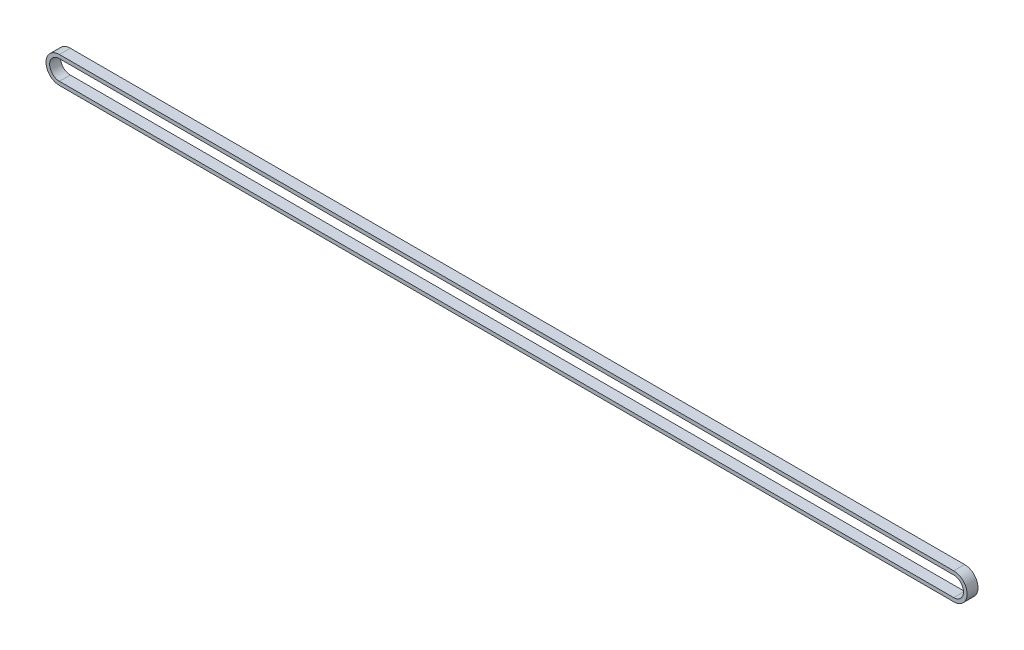
ISO-10303-21;
HEADER;
FILE_DESCRIPTION(('STEP AP214'),'2;1');
FILE_NAME('part.step','',(''),(''),'','','');
FILE_SCHEMA(('AUTOMOTIVE_DESIGN { 1 0 10303 214 1 1 1 1 }'));
ENDSEC;
DATA;
#1=APPLICATION_CONTEXT('core data for automotive mechanical design processes');
#2=APPLICATION_PROTOCOL_DEFINITION('international standard','automotive_design',2000,#1);
#3=PRODUCT_CONTEXT('',#1,'mechanical');
#4=PRODUCT('Part','Part','',(#3));
#5=PRODUCT_RELATED_PRODUCT_CATEGORY('part','',(#4));
#6=PRODUCT_DEFINITION_FORMATION('','',#4);
#7=PRODUCT_DEFINITION_CONTEXT('part definition',#1,'design');
#8=PRODUCT_DEFINITION('design','',#6,#7);
#9=PRODUCT_DEFINITION_SHAPE('','',#8);
#10=(LENGTH_UNIT() NAMED_UNIT(*) SI_UNIT(.MILLI.,.METRE.));
#11=(NAMED_UNIT(*) PLANE_ANGLE_UNIT() SI_UNIT($,.RADIAN.));
#12=(NAMED_UNIT(*) SI_UNIT($,.STERADIAN.) SOLID_ANGLE_UNIT());
#13=UNCERTAINTY_MEASURE_WITH_UNIT(LENGTH_MEASURE(1.E-05),#10,'distance_accuracy_value','');
#14=(GEOMETRIC_REPRESENTATION_CONTEXT(3) GLOBAL_UNCERTAINTY_ASSIGNED_CONTEXT((#13)) GLOBAL_UNIT_ASSIGNED_CONTEXT((#10,
#11,#12)) REPRESENTATION_CONTEXT('',''));
#15=CARTESIAN_POINT('',(0.,0.,0.));
#16=DIRECTION('',(0.,0.,1.));
#17=DIRECTION('',(1.,0.,0.));
#18=AXIS2_PLACEMENT_3D('',#15,#16,#17);
#19=CARTESIAN_POINT('',(0.,-7.4,3.));
#20=DIRECTION('',(0.,1.,0.));
#21=DIRECTION('',(0.,0.,1.));
#22=AXIS2_PLACEMENT_3D('',#19,#20,#21);
#23=PLANE('',#22);
#24=DIRECTION('',(1.,0.,0.));
#25=VECTOR('',#24,1.);
#26=CARTESIAN_POINT('',(0.,-7.4,-3.));
#27=LINE('',#26,#25);
#28=CARTESIAN_POINT('',(-246.5,-7.40000000000001,-3.));
#29=VERTEX_POINT('',#28);
#30=CARTESIAN_POINT('',(246.5,-7.40000000000001,-3.));
#31=VERTEX_POINT('',#30);
#32=EDGE_CURVE('E143',#29,#31,#27,.T.);
#33=ORIENTED_EDGE('',*,*,#32,.T.);
#34=DIRECTION('',(0.,0.,-1.));
#35=VECTOR('',#34,1.);
#36=CARTESIAN_POINT('',(246.5,-7.40000000000001,3.));
#37=LINE('',#36,#35);
#38=CARTESIAN_POINT('',(246.5,-7.40000000000001,3.));
#39=VERTEX_POINT('',#38);
#40=EDGE_CURVE('E11',#39,#31,#37,.T.);
#41=ORIENTED_EDGE('',*,*,#40,.F.);
#42=DIRECTION('',(1.,0.,0.));
#43=VECTOR('',#42,1.);
#44=CARTESIAN_POINT('',(0.,-7.4,3.));
#45=LINE('',#44,#43);
#46=CARTESIAN_POINT('',(-246.5,-7.40000000000001,3.));
#47=VERTEX_POINT('',#46);
#48=EDGE_CURVE('E123',#47,#39,#45,.T.);
#49=ORIENTED_EDGE('',*,*,#48,.F.);
#50=DIRECTION('',(0.,0.,-1.));
#51=VECTOR('',#50,1.);
#52=CARTESIAN_POINT('',(-246.5,-7.40000000000001,3.));
#53=LINE('',#52,#51);
#54=EDGE_CURVE('E150',#47,#29,#53,.T.);
#55=ORIENTED_EDGE('',*,*,#54,.T.);
#56=EDGE_LOOP('',(#33,#41,#49,#55));
#57=FACE_BOUND('',#56,.T.);
#58=ADVANCED_FACE('F37',(#57),#23,.F.);
#59=CARTESIAN_POINT('',(246.5,0.,3.));
#60=DIRECTION('',(0.,0.,-1.));
#61=DIRECTION('',(-1.,0.,0.));
#62=AXIS2_PLACEMENT_3D('',#59,#60,#61);
#63=CYLINDRICAL_SURFACE('',#62,7.40000000000002);
#64=CARTESIAN_POINT('',(246.5,0.,-3.));
#65=DIRECTION('',(0.,0.,1.));
#66=DIRECTION('',(1.,0.,0.));
#67=AXIS2_PLACEMENT_3D('',#64,#65,#66);
#68=CIRCLE('',#67,7.40000000000002);
#69=CARTESIAN_POINT('',(246.5,7.40000000000001,-3.));
#70=VERTEX_POINT('',#69);
#71=EDGE_CURVE('E114',#70,#31,#68,.F.);
#72=ORIENTED_EDGE('',*,*,#71,.F.);
#73=DIRECTION('',(0.,0.,-1.));
#74=VECTOR('',#73,1.);
#75=CARTESIAN_POINT('',(246.5,7.40000000000001,3.));
#76=LINE('',#75,#74);
#77=CARTESIAN_POINT('',(246.5,7.40000000000001,3.));
#78=VERTEX_POINT('',#77);
#79=EDGE_CURVE('E47',#78,#70,#76,.T.);
#80=ORIENTED_EDGE('',*,*,#79,.F.);
#81=CARTESIAN_POINT('',(246.5,0.,3.));
#82=DIRECTION('',(0.,0.,1.));
#83=DIRECTION('',(1.,0.,0.));
#84=AXIS2_PLACEMENT_3D('',#81,#82,#83);
#85=CIRCLE('',#84,7.40000000000002);
#86=EDGE_CURVE('E112',#78,#39,#85,.F.);
#87=ORIENTED_EDGE('',*,*,#86,.T.);
#88=ORIENTED_EDGE('',*,*,#40,.T.);
#89=EDGE_LOOP('',(#72,#80,#87,#88));
#90=FACE_BOUND('',#89,.T.);
#91=ADVANCED_FACE('F111',(#90),#63,.T.);
#92=CARTESIAN_POINT('',(0.,7.4,3.));
#93=DIRECTION('',(0.,1.,0.));
#94=DIRECTION('',(0.,0.,1.));
#95=AXIS2_PLACEMENT_3D('',#92,#93,#94);
#96=PLANE('',#95);
#97=DIRECTION('',(1.,0.,0.));
#98=VECTOR('',#97,1.);
#99=CARTESIAN_POINT('',(0.,7.4,-3.));
#100=LINE('',#99,#98);
#101=CARTESIAN_POINT('',(-246.5,7.40000000000001,-3.));
#102=VERTEX_POINT('',#101);
#103=EDGE_CURVE('E147',#102,#70,#100,.T.);
#104=ORIENTED_EDGE('',*,*,#103,.F.);
#105=DIRECTION('',(0.,0.,-1.));
#106=VECTOR('',#105,1.);
#107=CARTESIAN_POINT('',(-246.5,7.40000000000001,3.));
#108=LINE('',#107,#106);
#109=CARTESIAN_POINT('',(-246.5,7.40000000000001,3.));
#110=VERTEX_POINT('',#109);
#111=EDGE_CURVE('E83',#110,#102,#108,.T.);
#112=ORIENTED_EDGE('',*,*,#111,.F.);
#113=DIRECTION('',(1.,0.,0.));
#114=VECTOR('',#113,1.);
#115=CARTESIAN_POINT('',(0.,7.4,3.));
#116=LINE('',#115,#114);
#117=EDGE_CURVE('E121',#110,#78,#116,.T.);
#118=ORIENTED_EDGE('',*,*,#117,.T.);
#119=ORIENTED_EDGE('',*,*,#79,.T.);
#120=EDGE_LOOP('',(#104,#112,#118,#119));
#121=FACE_BOUND('',#120,.T.);
#122=ADVANCED_FACE('F126',(#121),#96,.T.);
#123=CARTESIAN_POINT('',(246.5,0.,3.));
#124=DIRECTION('',(0.,0.,-1.));
#125=DIRECTION('',(-1.,0.,0.));
#126=AXIS2_PLACEMENT_3D('',#123,#124,#125);
#127=CYLINDRICAL_SURFACE('',#126,5.40000000000002);
#128=CARTESIAN_POINT('',(246.5,0.,-3.));
#129=DIRECTION('',(0.,0.,1.));
#130=DIRECTION('',(1.,0.,0.));
#131=AXIS2_PLACEMENT_3D('',#128,#129,#130);
#132=CIRCLE('',#131,5.40000000000002);
#133=CARTESIAN_POINT('',(246.5,5.4,-3.));
#134=VERTEX_POINT('',#133);
#135=CARTESIAN_POINT('',(246.5,-5.4,-3.));
#136=VERTEX_POINT('',#135);
#137=EDGE_CURVE('E132',#134,#136,#132,.F.);
#138=ORIENTED_EDGE('',*,*,#137,.T.);
#139=DIRECTION('',(0.,0.,-1.));
#140=VECTOR('',#139,1.);
#141=CARTESIAN_POINT('',(246.5,-5.4,3.));
#142=LINE('',#141,#140);
#143=CARTESIAN_POINT('',(246.5,-5.4,3.));
#144=VERTEX_POINT('',#143);
#145=EDGE_CURVE('E41',#144,#136,#142,.T.);
#146=ORIENTED_EDGE('',*,*,#145,.F.);
#147=CARTESIAN_POINT('',(246.5,0.,3.));
#148=DIRECTION('',(0.,0.,1.));
#149=DIRECTION('',(1.,0.,0.));
#150=AXIS2_PLACEMENT_3D('',#147,#148,#149);
#151=CIRCLE('',#150,5.40000000000002);
#152=CARTESIAN_POINT('',(246.5,5.4,3.));
#153=VERTEX_POINT('',#152);
#154=EDGE_CURVE('E95',#153,#144,#151,.F.);
#155=ORIENTED_EDGE('',*,*,#154,.F.);
#156=DIRECTION('',(0.,0.,-1.));
#157=VECTOR('',#156,1.);
#158=CARTESIAN_POINT('',(246.5,5.4,3.));
#159=LINE('',#158,#157);
#160=EDGE_CURVE('E128',#153,#134,#159,.T.);
#161=ORIENTED_EDGE('',*,*,#160,.T.);
#162=EDGE_LOOP('',(#138,#146,#155,#161));
#163=FACE_BOUND('',#162,.T.);
#164=ADVANCED_FACE('F39',(#163),#127,.F.);
#165=CARTESIAN_POINT('',(0.,-5.4,3.));
#166=DIRECTION('',(0.,1.,0.));
#167=DIRECTION('',(0.,0.,1.));
#168=AXIS2_PLACEMENT_3D('',#165,#166,#167);
#169=PLANE('',#168);
#170=DIRECTION('',(1.,0.,0.));
#171=VECTOR('',#170,1.);
#172=CARTESIAN_POINT('',(0.,-5.4,-3.));
#173=LINE('',#172,#171);
#174=CARTESIAN_POINT('',(-246.5,-5.4,-3.));
#175=VERTEX_POINT('',#174);
#176=EDGE_CURVE('E135',#175,#136,#173,.T.);
#177=ORIENTED_EDGE('',*,*,#176,.F.);
#178=DIRECTION('',(0.,0.,-1.));
#179=VECTOR('',#178,1.);
#180=CARTESIAN_POINT('',(-246.5,-5.4,3.));
#181=LINE('',#180,#179);
#182=CARTESIAN_POINT('',(-246.5,-5.4,3.));
#183=VERTEX_POINT('',#182);
#184=EDGE_CURVE('E156',#183,#175,#181,.T.);
#185=ORIENTED_EDGE('',*,*,#184,.F.);
#186=DIRECTION('',(1.,0.,0.));
#187=VECTOR('',#186,1.);
#188=CARTESIAN_POINT('',(0.,-5.4,3.));
#189=LINE('',#188,#187);
#190=EDGE_CURVE('E164',#183,#144,#189,.T.);
#191=ORIENTED_EDGE('',*,*,#190,.T.);
#192=ORIENTED_EDGE('',*,*,#145,.T.);
#193=EDGE_LOOP('',(#177,#185,#191,#192));
#194=FACE_BOUND('',#193,.T.);
#195=ADVANCED_FACE('F163',(#194),#169,.T.);
#196=CARTESIAN_POINT('',(-246.5,0.,3.));
#197=DIRECTION('',(0.,0.,-1.));
#198=DIRECTION('',(-1.,0.,0.));
#199=AXIS2_PLACEMENT_3D('',#196,#197,#198);
#200=CYLINDRICAL_SURFACE('',#199,5.40000000000002);
#201=CARTESIAN_POINT('',(-246.5,0.,-3.));
#202=DIRECTION('',(0.,0.,1.));
#203=DIRECTION('',(1.,0.,0.));
#204=AXIS2_PLACEMENT_3D('',#201,#202,#203);
#205=CIRCLE('',#204,5.40000000000002);
#206=CARTESIAN_POINT('',(-246.5,5.4,-3.));
#207=VERTEX_POINT('',#206);
#208=EDGE_CURVE('E138',#207,#175,#205,.T.);
#209=ORIENTED_EDGE('',*,*,#208,.F.);
#210=DIRECTION('',(0.,0.,-1.));
#211=VECTOR('',#210,1.);
#212=CARTESIAN_POINT('',(-246.5,5.4,3.));
#213=LINE('',#212,#211);
#214=CARTESIAN_POINT('',(-246.5,5.4,3.));
#215=VERTEX_POINT('',#214);
#216=EDGE_CURVE('E155',#215,#207,#213,.T.);
#217=ORIENTED_EDGE('',*,*,#216,.F.);
#218=CARTESIAN_POINT('',(-246.5,0.,3.));
#219=DIRECTION('',(0.,0.,1.));
#220=DIRECTION('',(1.,0.,0.));
#221=AXIS2_PLACEMENT_3D('',#218,#219,#220);
#222=CIRCLE('',#221,5.40000000000002);
#223=EDGE_CURVE('E175',#215,#183,#222,.T.);
#224=ORIENTED_EDGE('',*,*,#223,.T.);
#225=ORIENTED_EDGE('',*,*,#184,.T.);
#226=EDGE_LOOP('',(#209,#217,#224,#225));
#227=FACE_BOUND('',#226,.T.);
#228=ADVANCED_FACE('F172',(#227),#200,.F.);
#229=CARTESIAN_POINT('',(0.,5.4,3.));
#230=DIRECTION('',(0.,1.,0.));
#231=DIRECTION('',(0.,0.,1.));
#232=AXIS2_PLACEMENT_3D('',#229,#230,#231);
#233=PLANE('',#232);
#234=DIRECTION('',(1.,0.,0.));
#235=VECTOR('',#234,1.);
#236=CARTESIAN_POINT('',(0.,5.4,-3.));
#237=LINE('',#236,#235);
#238=EDGE_CURVE('E141',#207,#134,#237,.T.);
#239=ORIENTED_EDGE('',*,*,#238,.T.);
#240=ORIENTED_EDGE('',*,*,#160,.F.);
#241=DIRECTION('',(1.,0.,0.));
#242=VECTOR('',#241,1.);
#243=CARTESIAN_POINT('',(0.,5.4,3.));
#244=LINE('',#243,#242);
#245=EDGE_CURVE('E177',#215,#153,#244,.T.);
#246=ORIENTED_EDGE('',*,*,#245,.F.);
#247=ORIENTED_EDGE('',*,*,#216,.T.);
#248=EDGE_LOOP('',(#239,#240,#246,#247));
#249=FACE_BOUND('',#248,.T.);
#250=ADVANCED_FACE('F178',(#249),#233,.F.);
#251=CARTESIAN_POINT('',(-246.5,0.,3.));
#252=DIRECTION('',(0.,0.,-1.));
#253=DIRECTION('',(-1.,0.,0.));
#254=AXIS2_PLACEMENT_3D('',#251,#252,#253);
#255=CYLINDRICAL_SURFACE('',#254,7.40000000000002);
#256=CARTESIAN_POINT('',(-246.5,0.,-3.));
#257=DIRECTION('',(0.,0.,1.));
#258=DIRECTION('',(1.,0.,0.));
#259=AXIS2_PLACEMENT_3D('',#256,#257,#258);
#260=CIRCLE('',#259,7.40000000000002);
#261=EDGE_CURVE('E86',#102,#29,#260,.T.);
#262=ORIENTED_EDGE('',*,*,#261,.T.);
#263=ORIENTED_EDGE('',*,*,#54,.F.);
#264=CARTESIAN_POINT('',(-246.5,0.,3.));
#265=DIRECTION('',(0.,0.,1.));
#266=DIRECTION('',(1.,0.,0.));
#267=AXIS2_PLACEMENT_3D('',#264,#265,#266);
#268=CIRCLE('',#267,7.40000000000002);
#269=EDGE_CURVE('E56',#110,#47,#268,.T.);
#270=ORIENTED_EDGE('',*,*,#269,.F.);
#271=ORIENTED_EDGE('',*,*,#111,.T.);
#272=EDGE_LOOP('',(#262,#263,#270,#271));
#273=FACE_BOUND('',#272,.T.);
#274=ADVANCED_FACE('F184',(#273),#255,.T.);
#275=CARTESIAN_POINT('',(0.,0.,3.));
#276=DIRECTION('',(0.,0.,1.));
#277=DIRECTION('',(1.,0.,0.));
#278=AXIS2_PLACEMENT_3D('',#275,#276,#277);
#279=PLANE('',#278);
#280=ORIENTED_EDGE('',*,*,#154,.T.);
#281=ORIENTED_EDGE('',*,*,#190,.F.);
#282=ORIENTED_EDGE('',*,*,#223,.F.);
#283=ORIENTED_EDGE('',*,*,#245,.T.);
#284=EDGE_LOOP('',(#280,#281,#282,#283));
#285=FACE_BOUND('',#284,.T.);
#286=ORIENTED_EDGE('',*,*,#48,.T.);
#287=ORIENTED_EDGE('',*,*,#86,.F.);
#288=ORIENTED_EDGE('',*,*,#117,.F.);
#289=ORIENTED_EDGE('',*,*,#269,.T.);
#290=EDGE_LOOP('',(#286,#287,#288,#289));
#291=FACE_BOUND('',#290,.T.);
#292=ADVANCED_FACE('F120',(#285,#291),#279,.T.);
#293=CARTESIAN_POINT('',(0.,0.,-3.));
#294=DIRECTION('',(0.,0.,1.));
#295=DIRECTION('',(1.,0.,0.));
#296=AXIS2_PLACEMENT_3D('',#293,#294,#295);
#297=PLANE('',#296);
#298=ORIENTED_EDGE('',*,*,#137,.F.);
#299=ORIENTED_EDGE('',*,*,#238,.F.);
#300=ORIENTED_EDGE('',*,*,#208,.T.);
#301=ORIENTED_EDGE('',*,*,#176,.T.);
#302=EDGE_LOOP('',(#298,#299,#300,#301));
#303=FACE_BOUND('',#302,.T.);
#304=ORIENTED_EDGE('',*,*,#32,.F.);
#305=ORIENTED_EDGE('',*,*,#261,.F.);
#306=ORIENTED_EDGE('',*,*,#103,.T.);
#307=ORIENTED_EDGE('',*,*,#71,.T.);
#308=EDGE_LOOP('',(#304,#305,#306,#307));
#309=FACE_BOUND('',#308,.T.);
#310=ADVANCED_FACE('F170',(#303,#309),#297,.F.);
#311=CLOSED_SHELL('',(#58,#91,#122,#164,#195,#228,#250,#274,#292,#310));
#312=MANIFOLD_SOLID_BREP('B2',#311);
#313=ADVANCED_BREP_SHAPE_REPRESENTATION('',(#18,#312),#14);
#314=SHAPE_DEFINITION_REPRESENTATION(#9,#313);
ENDSEC;
END-ISO-10303-21;
